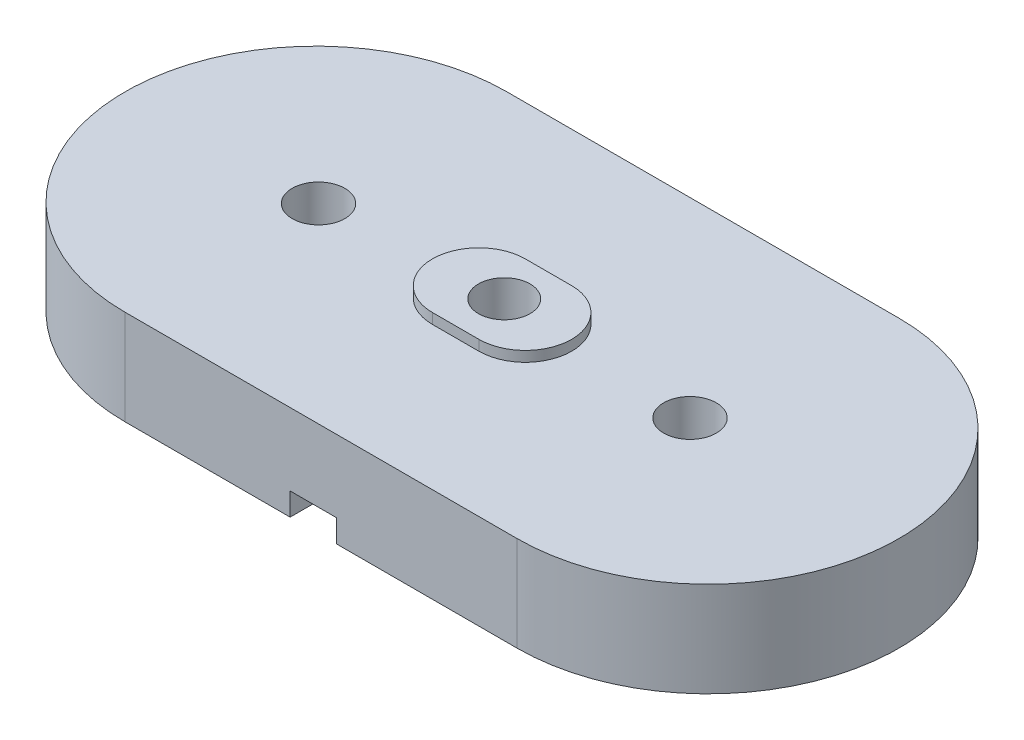
ISO-10303-21;
HEADER;
FILE_DESCRIPTION(('STEP AP214'),'2;1');
FILE_NAME('part.step','',(''),(''),'','','');
FILE_SCHEMA(('AUTOMOTIVE_DESIGN { 1 0 10303 214 1 1 1 1 }'));
ENDSEC;
DATA;
#1=APPLICATION_CONTEXT('core data for automotive mechanical design processes');
#2=APPLICATION_PROTOCOL_DEFINITION('international standard','automotive_design',2000,#1);
#3=PRODUCT_CONTEXT('',#1,'mechanical');
#4=PRODUCT('Part','Part','',(#3));
#5=PRODUCT_RELATED_PRODUCT_CATEGORY('part','',(#4));
#6=PRODUCT_DEFINITION_FORMATION('','',#4);
#7=PRODUCT_DEFINITION_CONTEXT('part definition',#1,'design');
#8=PRODUCT_DEFINITION('design','',#6,#7);
#9=PRODUCT_DEFINITION_SHAPE('','',#8);
#10=(LENGTH_UNIT() NAMED_UNIT(*) SI_UNIT(.MILLI.,.METRE.));
#11=(NAMED_UNIT(*) PLANE_ANGLE_UNIT() SI_UNIT($,.RADIAN.));
#12=(NAMED_UNIT(*) SI_UNIT($,.STERADIAN.) SOLID_ANGLE_UNIT());
#13=UNCERTAINTY_MEASURE_WITH_UNIT(LENGTH_MEASURE(1.E-05),#10,'distance_accuracy_value','');
#14=(GEOMETRIC_REPRESENTATION_CONTEXT(3) GLOBAL_UNCERTAINTY_ASSIGNED_CONTEXT((#13)) GLOBAL_UNIT_ASSIGNED_CONTEXT((#10,
#11,#12)) REPRESENTATION_CONTEXT('',''));
#15=CARTESIAN_POINT('',(0.,0.,0.));
#16=DIRECTION('',(0.,0.,1.));
#17=DIRECTION('',(1.,0.,0.));
#18=AXIS2_PLACEMENT_3D('',#15,#16,#17);
#19=CARTESIAN_POINT('',(0.,0.,0.));
#20=DIRECTION('',(0.,1.,0.));
#21=DIRECTION('',(0.,0.,1.));
#22=AXIS2_PLACEMENT_3D('',#19,#20,#21);
#23=PLANE('',#22);
#24=CARTESIAN_POINT('',(1.25000000000343,0.,0.));
#25=DIRECTION('',(0.,1.,0.));
#26=DIRECTION('',(0.,0.,1.));
#27=AXIS2_PLACEMENT_3D('',#24,#25,#26);
#28=CIRCLE('',#27,12.75);
#29=CARTESIAN_POINT('',(1.25000000000343,0.,12.75));
#30=VERTEX_POINT('',#29);
#31=EDGE_CURVE('E368',#30,#30,#28,.T.);
#32=ORIENTED_EDGE('',*,*,#31,.T.);
#33=EDGE_LOOP('',(#32));
#34=FACE_BOUND('',#33,.T.);
#35=DIRECTION('',(-1.,0.,0.));
#36=VECTOR('',#35,1.);
#37=CARTESIAN_POINT('',(0.,0.,-92.5));
#38=LINE('',#37,#36);
#39=CARTESIAN_POINT('',(80.0000000000038,0.,-92.5));
#40=VERTEX_POINT('',#39);
#41=CARTESIAN_POINT('',(0.,0.,-92.5));
#42=VERTEX_POINT('',#41);
#43=EDGE_CURVE('E279',#40,#42,#38,.T.);
#44=ORIENTED_EDGE('',*,*,#43,.F.);
#45=DIRECTION('',(0.,0.,-1.));
#46=VECTOR('',#45,1.);
#47=CARTESIAN_POINT('',(80.0000000000038,0.,-92.5));
#48=LINE('',#47,#46);
#49=CARTESIAN_POINT('',(80.0000000000034,0.,-22.5));
#50=VERTEX_POINT('',#49);
#51=EDGE_CURVE('E208',#50,#40,#48,.T.);
#52=ORIENTED_EDGE('',*,*,#51,.F.);
#53=CARTESIAN_POINT('',(80.0000000000034,0.,0.));
#54=DIRECTION('',(0.,-1.,0.));
#55=DIRECTION('',(0.,0.,-1.));
#56=AXIS2_PLACEMENT_3D('',#53,#54,#55);
#57=CIRCLE('',#56,22.5);
#58=CARTESIAN_POINT('',(80.0000000000033,0.,22.5));
#59=VERTEX_POINT('',#58);
#60=EDGE_CURVE('E238',#59,#50,#57,.T.);
#61=ORIENTED_EDGE('',*,*,#60,.F.);
#62=DIRECTION('',(0.,0.,-1.));
#63=VECTOR('',#62,1.);
#64=CARTESIAN_POINT('',(80.0000000000033,0.,22.5));
#65=LINE('',#64,#63);
#66=CARTESIAN_POINT('',(80.0000000000031,0.,92.5));
#67=VERTEX_POINT('',#66);
#68=EDGE_CURVE('E235',#67,#59,#65,.T.);
#69=ORIENTED_EDGE('',*,*,#68,.F.);
#70=DIRECTION('',(1.,0.,0.));
#71=VECTOR('',#70,1.);
#72=CARTESIAN_POINT('',(0.,0.,92.5));
#73=LINE('',#72,#71);
#74=CARTESIAN_POINT('',(0.,0.,92.5));
#75=VERTEX_POINT('',#74);
#76=EDGE_CURVE('E274',#75,#67,#73,.T.);
#77=ORIENTED_EDGE('',*,*,#76,.F.);
#78=CARTESIAN_POINT('',(0.,0.,0.));
#79=DIRECTION('',(0.,1.,0.));
#80=DIRECTION('',(0.,0.,1.));
#81=AXIS2_PLACEMENT_3D('',#78,#79,#80);
#82=CIRCLE('',#81,92.5);
#83=EDGE_CURVE('E245',#42,#75,#82,.T.);
#84=ORIENTED_EDGE('',*,*,#83,.F.);
#85=EDGE_LOOP('',(#44,#52,#61,#69,#77,#84));
#86=FACE_BOUND('',#85,.T.);
#87=ADVANCED_FACE('F41',(#34,#86),#23,.F.);
#88=CARTESIAN_POINT('',(0.,46.,0.));
#89=DIRECTION('',(0.,-1.,0.));
#90=DIRECTION('',(0.,0.,-1.));
#91=AXIS2_PLACEMENT_3D('',#88,#89,#90);
#92=CYLINDRICAL_SURFACE('',#91,92.5);
#93=ORIENTED_EDGE('',*,*,#83,.T.);
#94=DIRECTION('',(0.,-1.,0.));
#95=VECTOR('',#94,1.);
#96=CARTESIAN_POINT('',(0.,46.,92.5));
#97=LINE('',#96,#95);
#98=CARTESIAN_POINT('',(0.,46.,92.5));
#99=VERTEX_POINT('',#98);
#100=EDGE_CURVE('E11',#99,#75,#97,.T.);
#101=ORIENTED_EDGE('',*,*,#100,.F.);
#102=CARTESIAN_POINT('',(0.,46.,0.));
#103=DIRECTION('',(0.,1.,0.));
#104=DIRECTION('',(0.,0.,1.));
#105=AXIS2_PLACEMENT_3D('',#102,#103,#104);
#106=CIRCLE('',#105,92.5);
#107=CARTESIAN_POINT('',(0.,46.,-92.5));
#108=VERTEX_POINT('',#107);
#109=EDGE_CURVE('E260',#108,#99,#106,.T.);
#110=ORIENTED_EDGE('',*,*,#109,.F.);
#111=DIRECTION('',(0.,-1.,0.));
#112=VECTOR('',#111,1.);
#113=CARTESIAN_POINT('',(0.,46.,-92.5));
#114=LINE('',#113,#112);
#115=EDGE_CURVE('E270',#108,#42,#114,.T.);
#116=ORIENTED_EDGE('',*,*,#115,.T.);
#117=EDGE_LOOP('',(#93,#101,#110,#116));
#118=FACE_BOUND('',#117,.T.);
#119=ADVANCED_FACE('F43',(#118),#92,.T.);
#120=CARTESIAN_POINT('',(0.,46.,92.5));
#121=DIRECTION('',(0.,0.,-1.));
#122=DIRECTION('',(-1.,0.,0.));
#123=AXIS2_PLACEMENT_3D('',#120,#121,#122);
#124=PLANE('',#123);
#125=ORIENTED_EDGE('',*,*,#76,.T.);
#126=DIRECTION('',(0.,-1.,0.));
#127=VECTOR('',#126,1.);
#128=CARTESIAN_POINT('',(80.0000000000031,11.,92.5));
#129=LINE('',#128,#127);
#130=CARTESIAN_POINT('',(80.0000000000031,11.,92.5));
#131=VERTEX_POINT('',#130);
#132=EDGE_CURVE('E250',#131,#67,#129,.T.);
#133=ORIENTED_EDGE('',*,*,#132,.F.);
#134=DIRECTION('',(-1.,0.,0.));
#135=VECTOR('',#134,1.);
#136=CARTESIAN_POINT('',(80.0000000000031,11.,92.5));
#137=LINE('',#136,#135);
#138=CARTESIAN_POINT('',(102.500000000004,11.,92.5));
#139=VERTEX_POINT('',#138);
#140=EDGE_CURVE('E217',#139,#131,#137,.T.);
#141=ORIENTED_EDGE('',*,*,#140,.F.);
#142=DIRECTION('',(0.,-1.,0.));
#143=VECTOR('',#142,1.);
#144=CARTESIAN_POINT('',(102.500000000004,11.,92.5));
#145=LINE('',#144,#143);
#146=CARTESIAN_POINT('',(102.500000000004,0.,92.5));
#147=VERTEX_POINT('',#146);
#148=EDGE_CURVE('E252',#139,#147,#145,.T.);
#149=ORIENTED_EDGE('',*,*,#148,.T.);
#150=CARTESIAN_POINT('',(190.,0.,92.5));
#151=VERTEX_POINT('',#150);
#152=EDGE_CURVE('E273',#147,#151,#73,.T.);
#153=ORIENTED_EDGE('',*,*,#152,.T.);
#154=DIRECTION('',(0.,-1.,0.));
#155=VECTOR('',#154,1.);
#156=CARTESIAN_POINT('',(190.,46.,92.5));
#157=LINE('',#156,#155);
#158=CARTESIAN_POINT('',(190.,46.,92.5));
#159=VERTEX_POINT('',#158);
#160=EDGE_CURVE('E50',#159,#151,#157,.T.);
#161=ORIENTED_EDGE('',*,*,#160,.F.);
#162=DIRECTION('',(1.,0.,0.));
#163=VECTOR('',#162,1.);
#164=CARTESIAN_POINT('',(0.,46.,92.5));
#165=LINE('',#164,#163);
#166=EDGE_CURVE('E263',#99,#159,#165,.T.);
#167=ORIENTED_EDGE('',*,*,#166,.F.);
#168=ORIENTED_EDGE('',*,*,#100,.T.);
#169=EDGE_LOOP('',(#125,#133,#141,#149,#153,#161,#167,#168));
#170=FACE_BOUND('',#169,.T.);
#171=ADVANCED_FACE('F310',(#170),#124,.F.);
#172=CARTESIAN_POINT('',(190.,46.,0.));
#173=DIRECTION('',(0.,-1.,0.));
#174=DIRECTION('',(0.,0.,-1.));
#175=AXIS2_PLACEMENT_3D('',#172,#173,#174);
#176=CYLINDRICAL_SURFACE('',#175,92.5);
#177=CARTESIAN_POINT('',(190.,0.,0.));
#178=DIRECTION('',(0.,1.,0.));
#179=DIRECTION('',(0.,0.,1.));
#180=AXIS2_PLACEMENT_3D('',#177,#178,#179);
#181=CIRCLE('',#180,92.5);
#182=CARTESIAN_POINT('',(190.,0.,-92.5));
#183=VERTEX_POINT('',#182);
#184=EDGE_CURVE('E277',#151,#183,#181,.T.);
#185=ORIENTED_EDGE('',*,*,#184,.T.);
#186=DIRECTION('',(0.,-1.,0.));
#187=VECTOR('',#186,1.);
#188=CARTESIAN_POINT('',(190.,46.,-92.5));
#189=LINE('',#188,#187);
#190=CARTESIAN_POINT('',(190.,46.,-92.5));
#191=VERTEX_POINT('',#190);
#192=EDGE_CURVE('E284',#191,#183,#189,.T.);
#193=ORIENTED_EDGE('',*,*,#192,.F.);
#194=CARTESIAN_POINT('',(190.,46.,0.));
#195=DIRECTION('',(0.,1.,0.));
#196=DIRECTION('',(0.,0.,1.));
#197=AXIS2_PLACEMENT_3D('',#194,#195,#196);
#198=CIRCLE('',#197,92.5);
#199=EDGE_CURVE('E266',#159,#191,#198,.T.);
#200=ORIENTED_EDGE('',*,*,#199,.F.);
#201=ORIENTED_EDGE('',*,*,#160,.T.);
#202=EDGE_LOOP('',(#185,#193,#200,#201));
#203=FACE_BOUND('',#202,.T.);
#204=ADVANCED_FACE('F292',(#203),#176,.T.);
#205=CARTESIAN_POINT('',(0.,46.,-92.5));
#206=DIRECTION('',(0.,0.,1.));
#207=DIRECTION('',(1.,0.,0.));
#208=AXIS2_PLACEMENT_3D('',#205,#206,#207);
#209=PLANE('',#208);
#210=DIRECTION('',(1.,0.,0.));
#211=VECTOR('',#210,1.);
#212=CARTESIAN_POINT('',(80.0000000000038,11.,-92.5));
#213=LINE('',#212,#211);
#214=CARTESIAN_POINT('',(80.0000000000038,11.,-92.5));
#215=VERTEX_POINT('',#214);
#216=CARTESIAN_POINT('',(102.500000000003,11.,-92.5));
#217=VERTEX_POINT('',#216);
#218=EDGE_CURVE('E204',#215,#217,#213,.T.);
#219=ORIENTED_EDGE('',*,*,#218,.F.);
#220=DIRECTION('',(0.,-1.,0.));
#221=VECTOR('',#220,1.);
#222=CARTESIAN_POINT('',(80.0000000000038,11.,-92.5));
#223=LINE('',#222,#221);
#224=EDGE_CURVE('E242',#215,#40,#223,.T.);
#225=ORIENTED_EDGE('',*,*,#224,.T.);
#226=ORIENTED_EDGE('',*,*,#43,.T.);
#227=ORIENTED_EDGE('',*,*,#115,.F.);
#228=DIRECTION('',(-1.,0.,0.));
#229=VECTOR('',#228,1.);
#230=CARTESIAN_POINT('',(0.,46.,-92.5));
#231=LINE('',#230,#229);
#232=EDGE_CURVE('E268',#191,#108,#231,.T.);
#233=ORIENTED_EDGE('',*,*,#232,.F.);
#234=ORIENTED_EDGE('',*,*,#192,.T.);
#235=CARTESIAN_POINT('',(102.500000000003,0.,-92.5));
#236=VERTEX_POINT('',#235);
#237=EDGE_CURVE('E264',#183,#236,#38,.T.);
#238=ORIENTED_EDGE('',*,*,#237,.T.);
#239=DIRECTION('',(0.,-1.,0.));
#240=VECTOR('',#239,1.);
#241=CARTESIAN_POINT('',(102.500000000003,11.,-92.5));
#242=LINE('',#241,#240);
#243=EDGE_CURVE('E65',#217,#236,#242,.T.);
#244=ORIENTED_EDGE('',*,*,#243,.F.);
#245=EDGE_LOOP('',(#219,#225,#226,#227,#233,#234,#238,#244));
#246=FACE_BOUND('',#245,.T.);
#247=ADVANCED_FACE('F303',(#246),#209,.F.);
#248=CARTESIAN_POINT('',(0.,46.,0.));
#249=DIRECTION('',(0.,1.,0.));
#250=DIRECTION('',(0.,0.,1.));
#251=AXIS2_PLACEMENT_3D('',#248,#249,#250);
#252=PLANE('',#251);
#253=CARTESIAN_POINT('',(1.25000000000343,46.,0.));
#254=DIRECTION('',(0.,1.,0.));
#255=DIRECTION('',(0.,0.,1.));
#256=AXIS2_PLACEMENT_3D('',#253,#254,#255);
#257=CIRCLE('',#256,12.75);
#258=CARTESIAN_POINT('',(1.25000000000343,46.,12.75));
#259=VERTEX_POINT('',#258);
#260=EDGE_CURVE('E45',#259,#259,#257,.T.);
#261=ORIENTED_EDGE('',*,*,#260,.F.);
#262=EDGE_LOOP('',(#261));
#263=FACE_BOUND('',#262,.T.);
#264=CARTESIAN_POINT('',(181.250000000003,46.,0.));
#265=DIRECTION('',(0.,1.,0.));
#266=DIRECTION('',(0.,0.,1.));
#267=AXIS2_PLACEMENT_3D('',#264,#265,#266);
#268=CIRCLE('',#267,12.75);
#269=CARTESIAN_POINT('',(181.250000000003,46.,12.75));
#270=VERTEX_POINT('',#269);
#271=EDGE_CURVE('E370',#270,#270,#268,.T.);
#272=ORIENTED_EDGE('',*,*,#271,.F.);
#273=EDGE_LOOP('',(#272));
#274=FACE_BOUND('',#273,.T.);
#275=CARTESIAN_POINT('',(102.08951500032,46.,0.649819200286263));
#276=DIRECTION('',(0.,1.,0.));
#277=DIRECTION('',(0.,0.,1.));
#278=AXIS2_PLACEMENT_3D('',#275,#276,#277);
#279=CIRCLE('',#278,22.5);
#280=CARTESIAN_POINT('',(102.08951500032,46.,-21.8501807997137));
#281=VERTEX_POINT('',#280);
#282=CARTESIAN_POINT('',(102.08951500032,46.,23.1498192002863));
#283=VERTEX_POINT('',#282);
#284=EDGE_CURVE('E163',#281,#283,#279,.F.);
#285=ORIENTED_EDGE('',*,*,#284,.T.);
#286=DIRECTION('',(1.,0.,0.));
#287=VECTOR('',#286,1.);
#288=CARTESIAN_POINT('',(0.,46.,23.1498192002863));
#289=LINE('',#288,#287);
#290=CARTESIAN_POINT('',(79.5895150003206,46.,23.1498192002863));
#291=VERTEX_POINT('',#290);
#292=EDGE_CURVE('E178',#291,#283,#289,.T.);
#293=ORIENTED_EDGE('',*,*,#292,.F.);
#294=CARTESIAN_POINT('',(79.5895150003202,46.,0.649819200286263));
#295=DIRECTION('',(0.,1.,0.));
#296=DIRECTION('',(0.,0.,1.));
#297=AXIS2_PLACEMENT_3D('',#294,#295,#296);
#298=CIRCLE('',#297,22.5);
#299=CARTESIAN_POINT('',(79.5895150003206,46.,-21.8501807997137));
#300=VERTEX_POINT('',#299);
#301=EDGE_CURVE('E195',#300,#291,#298,.T.);
#302=ORIENTED_EDGE('',*,*,#301,.F.);
#303=DIRECTION('',(1.,0.,0.));
#304=VECTOR('',#303,1.);
#305=CARTESIAN_POINT('',(0.,46.,-21.8501807997137));
#306=LINE('',#305,#304);
#307=EDGE_CURVE('E193',#300,#281,#306,.T.);
#308=ORIENTED_EDGE('',*,*,#307,.T.);
#309=EDGE_LOOP('',(#285,#293,#302,#308));
#310=FACE_BOUND('',#309,.T.);
#311=ORIENTED_EDGE('',*,*,#109,.T.);
#312=ORIENTED_EDGE('',*,*,#166,.T.);
#313=ORIENTED_EDGE('',*,*,#199,.T.);
#314=ORIENTED_EDGE('',*,*,#232,.T.);
#315=EDGE_LOOP('',(#311,#312,#313,#314));
#316=FACE_BOUND('',#315,.T.);
#317=ADVANCED_FACE('F308',(#263,#274,#310,#316),#252,.T.);
#318=CARTESIAN_POINT('',(181.250000000003,0.,0.));
#319=DIRECTION('',(0.,1.,0.));
#320=DIRECTION('',(0.,0.,1.));
#321=AXIS2_PLACEMENT_3D('',#318,#319,#320);
#322=CIRCLE('',#321,12.75);
#323=CARTESIAN_POINT('',(181.250000000003,0.,12.75));
#324=VERTEX_POINT('',#323);
#325=EDGE_CURVE('E366',#324,#324,#322,.T.);
#326=ORIENTED_EDGE('',*,*,#325,.T.);
#327=EDGE_LOOP('',(#326));
#328=FACE_BOUND('',#327,.T.);
#329=ORIENTED_EDGE('',*,*,#152,.F.);
#330=DIRECTION('',(0.,0.,1.));
#331=VECTOR('',#330,1.);
#332=CARTESIAN_POINT('',(102.500000000004,0.,22.5));
#333=LINE('',#332,#331);
#334=CARTESIAN_POINT('',(102.500000000004,0.,22.5));
#335=VERTEX_POINT('',#334);
#336=EDGE_CURVE('E233',#335,#147,#333,.T.);
#337=ORIENTED_EDGE('',*,*,#336,.F.);
#338=CARTESIAN_POINT('',(102.500000000003,0.,0.));
#339=DIRECTION('',(0.,-1.,0.));
#340=DIRECTION('',(0.,0.,1.));
#341=AXIS2_PLACEMENT_3D('',#338,#339,#340);
#342=CIRCLE('',#341,22.5);
#343=CARTESIAN_POINT('',(102.500000000003,0.,-22.5));
#344=VERTEX_POINT('',#343);
#345=EDGE_CURVE('E230',#344,#335,#342,.T.);
#346=ORIENTED_EDGE('',*,*,#345,.F.);
#347=DIRECTION('',(0.,0.,1.));
#348=VECTOR('',#347,1.);
#349=CARTESIAN_POINT('',(102.500000000003,0.,-92.5));
#350=LINE('',#349,#348);
#351=EDGE_CURVE('E203',#236,#344,#350,.T.);
#352=ORIENTED_EDGE('',*,*,#351,.F.);
#353=ORIENTED_EDGE('',*,*,#237,.F.);
#354=ORIENTED_EDGE('',*,*,#184,.F.);
#355=EDGE_LOOP('',(#329,#337,#346,#352,#353,#354));
#356=FACE_BOUND('',#355,.T.);
#357=ADVANCED_FACE('F298',(#328,#356),#23,.F.);
#358=CARTESIAN_POINT('',(80.0000000000038,11.,-92.5));
#359=DIRECTION('',(-1.,0.,0.));
#360=DIRECTION('',(0.,0.,1.));
#361=AXIS2_PLACEMENT_3D('',#358,#359,#360);
#362=PLANE('',#361);
#363=ORIENTED_EDGE('',*,*,#51,.T.);
#364=ORIENTED_EDGE('',*,*,#224,.F.);
#365=DIRECTION('',(0.,0.,-1.));
#366=VECTOR('',#365,1.);
#367=CARTESIAN_POINT('',(80.0000000000038,11.,-92.5));
#368=LINE('',#367,#366);
#369=CARTESIAN_POINT('',(80.0000000000034,11.,-22.5));
#370=VERTEX_POINT('',#369);
#371=EDGE_CURVE('E226',#370,#215,#368,.T.);
#372=ORIENTED_EDGE('',*,*,#371,.F.);
#373=DIRECTION('',(0.,-1.,0.));
#374=VECTOR('',#373,1.);
#375=CARTESIAN_POINT('',(80.0000000000034,11.,-22.5));
#376=LINE('',#375,#374);
#377=EDGE_CURVE('E246',#370,#50,#376,.T.);
#378=ORIENTED_EDGE('',*,*,#377,.T.);
#379=EDGE_LOOP('',(#363,#364,#372,#378));
#380=FACE_BOUND('',#379,.T.);
#381=ADVANCED_FACE('F354',(#380),#362,.F.);
#382=CARTESIAN_POINT('',(80.0000000000034,11.,0.));
#383=DIRECTION('',(0.,-1.,0.));
#384=DIRECTION('',(0.,0.,-1.));
#385=AXIS2_PLACEMENT_3D('',#382,#383,#384);
#386=CYLINDRICAL_SURFACE('',#385,22.5);
#387=ORIENTED_EDGE('',*,*,#60,.T.);
#388=ORIENTED_EDGE('',*,*,#377,.F.);
#389=CARTESIAN_POINT('',(80.0000000000034,11.,0.));
#390=DIRECTION('',(0.,-1.,0.));
#391=DIRECTION('',(0.,0.,-1.));
#392=AXIS2_PLACEMENT_3D('',#389,#390,#391);
#393=CIRCLE('',#392,22.5);
#394=CARTESIAN_POINT('',(80.0000000000033,11.,22.5));
#395=VERTEX_POINT('',#394);
#396=EDGE_CURVE('E223',#395,#370,#393,.T.);
#397=ORIENTED_EDGE('',*,*,#396,.F.);
#398=DIRECTION('',(0.,-1.,0.));
#399=VECTOR('',#398,1.);
#400=CARTESIAN_POINT('',(80.0000000000033,11.,22.5));
#401=LINE('',#400,#399);
#402=EDGE_CURVE('E248',#395,#59,#401,.T.);
#403=ORIENTED_EDGE('',*,*,#402,.T.);
#404=EDGE_LOOP('',(#387,#388,#397,#403));
#405=FACE_BOUND('',#404,.T.);
#406=ADVANCED_FACE('F360',(#405),#386,.F.);
#407=CARTESIAN_POINT('',(80.0000000000033,11.,22.5));
#408=DIRECTION('',(-1.,0.,0.));
#409=DIRECTION('',(0.,0.,1.));
#410=AXIS2_PLACEMENT_3D('',#407,#408,#409);
#411=PLANE('',#410);
#412=ORIENTED_EDGE('',*,*,#68,.T.);
#413=ORIENTED_EDGE('',*,*,#402,.F.);
#414=DIRECTION('',(0.,0.,-1.));
#415=VECTOR('',#414,1.);
#416=CARTESIAN_POINT('',(80.0000000000033,11.,22.5));
#417=LINE('',#416,#415);
#418=EDGE_CURVE('E220',#131,#395,#417,.T.);
#419=ORIENTED_EDGE('',*,*,#418,.F.);
#420=ORIENTED_EDGE('',*,*,#132,.T.);
#421=EDGE_LOOP('',(#412,#413,#419,#420));
#422=FACE_BOUND('',#421,.T.);
#423=ADVANCED_FACE('F320',(#422),#411,.F.);
#424=CARTESIAN_POINT('',(102.500000000004,11.,22.5));
#425=DIRECTION('',(1.,0.,0.));
#426=DIRECTION('',(0.,0.,-1.));
#427=AXIS2_PLACEMENT_3D('',#424,#425,#426);
#428=PLANE('',#427);
#429=ORIENTED_EDGE('',*,*,#336,.T.);
#430=ORIENTED_EDGE('',*,*,#148,.F.);
#431=DIRECTION('',(0.,0.,1.));
#432=VECTOR('',#431,1.);
#433=CARTESIAN_POINT('',(102.500000000004,11.,22.5));
#434=LINE('',#433,#432);
#435=CARTESIAN_POINT('',(102.500000000004,11.,22.5));
#436=VERTEX_POINT('',#435);
#437=EDGE_CURVE('E214',#436,#139,#434,.T.);
#438=ORIENTED_EDGE('',*,*,#437,.F.);
#439=DIRECTION('',(0.,-1.,0.));
#440=VECTOR('',#439,1.);
#441=CARTESIAN_POINT('',(102.500000000004,11.,22.5));
#442=LINE('',#441,#440);
#443=EDGE_CURVE('E255',#436,#335,#442,.T.);
#444=ORIENTED_EDGE('',*,*,#443,.T.);
#445=EDGE_LOOP('',(#429,#430,#438,#444));
#446=FACE_BOUND('',#445,.T.);
#447=ADVANCED_FACE('F328',(#446),#428,.F.);
#448=CARTESIAN_POINT('',(102.500000000003,11.,0.));
#449=DIRECTION('',(0.,-1.,0.));
#450=DIRECTION('',(0.,0.,-1.));
#451=AXIS2_PLACEMENT_3D('',#448,#449,#450);
#452=CYLINDRICAL_SURFACE('',#451,22.5);
#453=ORIENTED_EDGE('',*,*,#345,.T.);
#454=ORIENTED_EDGE('',*,*,#443,.F.);
#455=CARTESIAN_POINT('',(102.500000000003,11.,0.));
#456=DIRECTION('',(0.,-1.,0.));
#457=DIRECTION('',(0.,0.,1.));
#458=AXIS2_PLACEMENT_3D('',#455,#456,#457);
#459=CIRCLE('',#458,22.5);
#460=CARTESIAN_POINT('',(102.500000000003,11.,-22.5));
#461=VERTEX_POINT('',#460);
#462=EDGE_CURVE('E211',#461,#436,#459,.T.);
#463=ORIENTED_EDGE('',*,*,#462,.F.);
#464=DIRECTION('',(0.,-1.,0.));
#465=VECTOR('',#464,1.);
#466=CARTESIAN_POINT('',(102.500000000003,11.,-22.5));
#467=LINE('',#466,#465);
#468=EDGE_CURVE('E257',#461,#344,#467,.T.);
#469=ORIENTED_EDGE('',*,*,#468,.T.);
#470=EDGE_LOOP('',(#453,#454,#463,#469));
#471=FACE_BOUND('',#470,.T.);
#472=ADVANCED_FACE('F330',(#471),#452,.F.);
#473=CARTESIAN_POINT('',(102.500000000003,11.,-92.5));
#474=DIRECTION('',(1.,0.,0.));
#475=DIRECTION('',(0.,0.,-1.));
#476=AXIS2_PLACEMENT_3D('',#473,#474,#475);
#477=PLANE('',#476);
#478=ORIENTED_EDGE('',*,*,#351,.T.);
#479=ORIENTED_EDGE('',*,*,#468,.F.);
#480=DIRECTION('',(0.,0.,1.));
#481=VECTOR('',#480,1.);
#482=CARTESIAN_POINT('',(102.500000000003,11.,-92.5));
#483=LINE('',#482,#481);
#484=EDGE_CURVE('E207',#217,#461,#483,.T.);
#485=ORIENTED_EDGE('',*,*,#484,.F.);
#486=ORIENTED_EDGE('',*,*,#243,.T.);
#487=EDGE_LOOP('',(#478,#479,#485,#486));
#488=FACE_BOUND('',#487,.T.);
#489=ADVANCED_FACE('F331',(#488),#477,.F.);
#490=CARTESIAN_POINT('',(102.500000000003,11.,0.));
#491=DIRECTION('',(0.,1.,0.));
#492=DIRECTION('',(0.,0.,1.));
#493=AXIS2_PLACEMENT_3D('',#490,#491,#492);
#494=PLANE('',#493);
#495=CARTESIAN_POINT('',(91.2500000000034,11.,0.));
#496=DIRECTION('',(0.,-1.,0.));
#497=DIRECTION('',(0.,0.,-1.));
#498=AXIS2_PLACEMENT_3D('',#495,#496,#497);
#499=CIRCLE('',#498,12.5);
#500=CARTESIAN_POINT('',(91.2500000000034,11.,-12.5));
#501=VERTEX_POINT('',#500);
#502=EDGE_CURVE('E168',#501,#501,#499,.T.);
#503=ORIENTED_EDGE('',*,*,#502,.F.);
#504=EDGE_LOOP('',(#503));
#505=FACE_BOUND('',#504,.T.);
#506=ORIENTED_EDGE('',*,*,#218,.T.);
#507=ORIENTED_EDGE('',*,*,#484,.T.);
#508=ORIENTED_EDGE('',*,*,#462,.T.);
#509=ORIENTED_EDGE('',*,*,#437,.T.);
#510=ORIENTED_EDGE('',*,*,#140,.T.);
#511=ORIENTED_EDGE('',*,*,#418,.T.);
#512=ORIENTED_EDGE('',*,*,#396,.T.);
#513=ORIENTED_EDGE('',*,*,#371,.T.);
#514=EDGE_LOOP('',(#506,#507,#508,#509,#510,#511,#512,#513));
#515=FACE_BOUND('',#514,.T.);
#516=ADVANCED_FACE('F324',(#505,#515),#494,.F.);
#517=CARTESIAN_POINT('',(91.2500000000034,46.,0.));
#518=DIRECTION('',(0.,-1.,0.));
#519=DIRECTION('',(0.,0.,-1.));
#520=AXIS2_PLACEMENT_3D('',#517,#518,#519);
#521=CYLINDRICAL_SURFACE('',#520,12.5);
#522=ORIENTED_EDGE('',*,*,#502,.T.);
#523=EDGE_LOOP('',(#522));
#524=FACE_BOUND('',#523,.T.);
#525=CARTESIAN_POINT('',(91.2500000000034,51.,0.));
#526=DIRECTION('',(0.,1.,0.));
#527=DIRECTION('',(0.,0.,1.));
#528=AXIS2_PLACEMENT_3D('',#525,#526,#527);
#529=CIRCLE('',#528,12.5);
#530=CARTESIAN_POINT('',(91.2500000000034,51.,12.5));
#531=VERTEX_POINT('',#530);
#532=EDGE_CURVE('E188',#531,#531,#529,.F.);
#533=ORIENTED_EDGE('',*,*,#532,.F.);
#534=EDGE_LOOP('',(#533));
#535=FACE_BOUND('',#534,.T.);
#536=ADVANCED_FACE('F338',(#524,#535),#521,.F.);
#537=CARTESIAN_POINT('',(102.08951500032,51.,0.649819200286263));
#538=DIRECTION('',(0.,-1.,0.));
#539=DIRECTION('',(0.,0.,-1.));
#540=AXIS2_PLACEMENT_3D('',#537,#538,#539);
#541=CYLINDRICAL_SURFACE('',#540,22.5);
#542=ORIENTED_EDGE('',*,*,#284,.F.);
#543=DIRECTION('',(0.,-1.,0.));
#544=VECTOR('',#543,1.);
#545=CARTESIAN_POINT('',(102.08951500032,51.,-21.8501807997137));
#546=LINE('',#545,#544);
#547=CARTESIAN_POINT('',(102.08951500032,51.,-21.8501807997137));
#548=VERTEX_POINT('',#547);
#549=EDGE_CURVE('E158',#548,#281,#546,.T.);
#550=ORIENTED_EDGE('',*,*,#549,.F.);
#551=CARTESIAN_POINT('',(102.08951500032,51.,0.649819200286263));
#552=DIRECTION('',(0.,1.,0.));
#553=DIRECTION('',(0.,0.,1.));
#554=AXIS2_PLACEMENT_3D('',#551,#552,#553);
#555=CIRCLE('',#554,22.5);
#556=CARTESIAN_POINT('',(102.08951500032,51.,23.1498192002863));
#557=VERTEX_POINT('',#556);
#558=EDGE_CURVE('E161',#548,#557,#555,.F.);
#559=ORIENTED_EDGE('',*,*,#558,.T.);
#560=DIRECTION('',(0.,-1.,0.));
#561=VECTOR('',#560,1.);
#562=CARTESIAN_POINT('',(102.08951500032,51.,23.1498192002863));
#563=LINE('',#562,#561);
#564=EDGE_CURVE('E191',#557,#283,#563,.T.);
#565=ORIENTED_EDGE('',*,*,#564,.T.);
#566=EDGE_LOOP('',(#542,#550,#559,#565));
#567=FACE_BOUND('',#566,.T.);
#568=ADVANCED_FACE('F160',(#567),#541,.T.);
#569=CARTESIAN_POINT('',(0.,51.,-21.8501807997137));
#570=DIRECTION('',(0.,0.,-1.));
#571=DIRECTION('',(-1.,0.,0.));
#572=AXIS2_PLACEMENT_3D('',#569,#570,#571);
#573=PLANE('',#572);
#574=ORIENTED_EDGE('',*,*,#307,.F.);
#575=DIRECTION('',(0.,-1.,0.));
#576=VECTOR('',#575,1.);
#577=CARTESIAN_POINT('',(79.5895150003206,51.,-21.8501807997137));
#578=LINE('',#577,#576);
#579=CARTESIAN_POINT('',(79.5895150003206,51.,-21.8501807997137));
#580=VERTEX_POINT('',#579);
#581=EDGE_CURVE('E169',#580,#300,#578,.T.);
#582=ORIENTED_EDGE('',*,*,#581,.F.);
#583=DIRECTION('',(1.,0.,0.));
#584=VECTOR('',#583,1.);
#585=CARTESIAN_POINT('',(0.,51.,-21.8501807997137));
#586=LINE('',#585,#584);
#587=EDGE_CURVE('E175',#580,#548,#586,.T.);
#588=ORIENTED_EDGE('',*,*,#587,.T.);
#589=ORIENTED_EDGE('',*,*,#549,.T.);
#590=EDGE_LOOP('',(#574,#582,#588,#589));
#591=FACE_BOUND('',#590,.T.);
#592=ADVANCED_FACE('F180',(#591),#573,.T.);
#593=CARTESIAN_POINT('',(79.5895150003202,51.,0.649819200286263));
#594=DIRECTION('',(0.,-1.,0.));
#595=DIRECTION('',(0.,0.,-1.));
#596=AXIS2_PLACEMENT_3D('',#593,#594,#595);
#597=CYLINDRICAL_SURFACE('',#596,22.5);
#598=ORIENTED_EDGE('',*,*,#301,.T.);
#599=DIRECTION('',(0.,-1.,0.));
#600=VECTOR('',#599,1.);
#601=CARTESIAN_POINT('',(79.5895150003206,51.,23.1498192002863));
#602=LINE('',#601,#600);
#603=CARTESIAN_POINT('',(79.5895150003206,51.,23.1498192002863));
#604=VERTEX_POINT('',#603);
#605=EDGE_CURVE('E57',#604,#291,#602,.T.);
#606=ORIENTED_EDGE('',*,*,#605,.F.);
#607=CARTESIAN_POINT('',(79.5895150003202,51.,0.649819200286263));
#608=DIRECTION('',(0.,1.,0.));
#609=DIRECTION('',(0.,0.,1.));
#610=AXIS2_PLACEMENT_3D('',#607,#608,#609);
#611=CIRCLE('',#610,22.5);
#612=EDGE_CURVE('E182',#580,#604,#611,.T.);
#613=ORIENTED_EDGE('',*,*,#612,.F.);
#614=ORIENTED_EDGE('',*,*,#581,.T.);
#615=EDGE_LOOP('',(#598,#606,#613,#614));
#616=FACE_BOUND('',#615,.T.);
#617=ADVANCED_FACE('F385',(#616),#597,.T.);
#618=CARTESIAN_POINT('',(0.,51.,23.1498192002863));
#619=DIRECTION('',(0.,0.,-1.));
#620=DIRECTION('',(-1.,0.,0.));
#621=AXIS2_PLACEMENT_3D('',#618,#619,#620);
#622=PLANE('',#621);
#623=ORIENTED_EDGE('',*,*,#292,.T.);
#624=ORIENTED_EDGE('',*,*,#564,.F.);
#625=DIRECTION('',(1.,0.,0.));
#626=VECTOR('',#625,1.);
#627=CARTESIAN_POINT('',(0.,51.,23.1498192002863));
#628=LINE('',#627,#626);
#629=EDGE_CURVE('E176',#604,#557,#628,.T.);
#630=ORIENTED_EDGE('',*,*,#629,.F.);
#631=ORIENTED_EDGE('',*,*,#605,.T.);
#632=EDGE_LOOP('',(#623,#624,#630,#631));
#633=FACE_BOUND('',#632,.T.);
#634=ADVANCED_FACE('F386',(#633),#622,.F.);
#635=CARTESIAN_POINT('',(0.,51.,0.));
#636=DIRECTION('',(0.,1.,0.));
#637=DIRECTION('',(0.,0.,1.));
#638=AXIS2_PLACEMENT_3D('',#635,#636,#637);
#639=PLANE('',#638);
#640=ORIENTED_EDGE('',*,*,#558,.F.);
#641=ORIENTED_EDGE('',*,*,#587,.F.);
#642=ORIENTED_EDGE('',*,*,#612,.T.);
#643=ORIENTED_EDGE('',*,*,#629,.T.);
#644=EDGE_LOOP('',(#640,#641,#642,#643));
#645=FACE_BOUND('',#644,.T.);
#646=ORIENTED_EDGE('',*,*,#532,.T.);
#647=EDGE_LOOP('',(#646));
#648=FACE_BOUND('',#647,.T.);
#649=ADVANCED_FACE('F173',(#645,#648),#639,.T.);
#650=CARTESIAN_POINT('',(181.250000000003,0.,0.));
#651=DIRECTION('',(0.,1.,0.));
#652=DIRECTION('',(0.,0.,1.));
#653=AXIS2_PLACEMENT_3D('',#650,#651,#652);
#654=CYLINDRICAL_SURFACE('',#653,12.75);
#655=ORIENTED_EDGE('',*,*,#271,.T.);
#656=EDGE_LOOP('',(#655));
#657=FACE_BOUND('',#656,.T.);
#658=ORIENTED_EDGE('',*,*,#325,.F.);
#659=EDGE_LOOP('',(#658));
#660=FACE_BOUND('',#659,.T.);
#661=ADVANCED_FACE('F392',(#657,#660),#654,.F.);
#662=CARTESIAN_POINT('',(1.25000000000343,0.,0.));
#663=DIRECTION('',(0.,1.,0.));
#664=DIRECTION('',(0.,0.,1.));
#665=AXIS2_PLACEMENT_3D('',#662,#663,#664);
#666=CYLINDRICAL_SURFACE('',#665,12.75);
#667=ORIENTED_EDGE('',*,*,#260,.T.);
#668=EDGE_LOOP('',(#667));
#669=FACE_BOUND('',#668,.T.);
#670=ORIENTED_EDGE('',*,*,#31,.F.);
#671=EDGE_LOOP('',(#670));
#672=FACE_BOUND('',#671,.T.);
#673=ADVANCED_FACE('F378',(#669,#672),#666,.F.);
#674=CLOSED_SHELL('',(#87,#119,#171,#204,#247,#317,#357,#381,#406,#423,#447,#472,#489,#516,#536,
#568,#592,#617,#634,#649,#661,#673));
#675=MANIFOLD_SOLID_BREP('B2',#674);
#676=ADVANCED_BREP_SHAPE_REPRESENTATION('',(#18,#675),#14);
#677=SHAPE_DEFINITION_REPRESENTATION(#9,#676);
ENDSEC;
END-ISO-10303-21;
